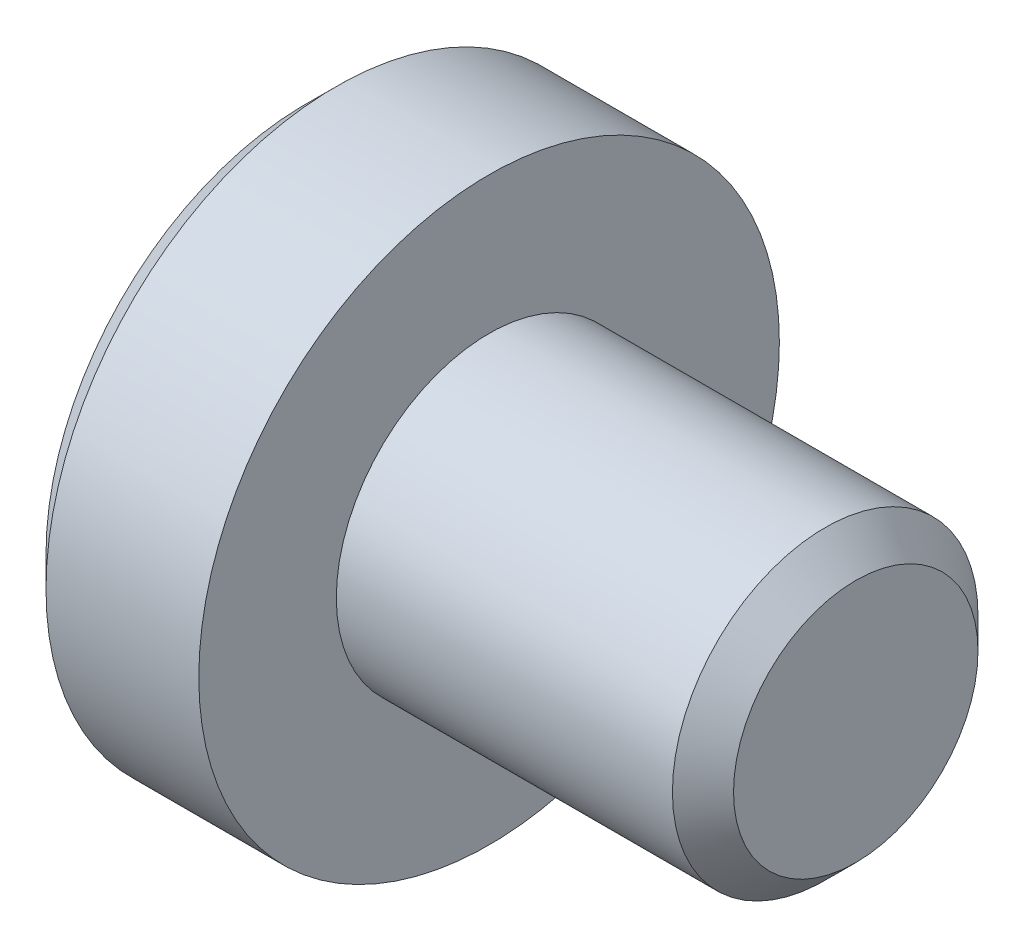
ISO-10303-21;
HEADER;
FILE_DESCRIPTION(('STEP AP214'),'2;1');
FILE_NAME('part.step','',(''),(''),'','','');
FILE_SCHEMA(('AUTOMOTIVE_DESIGN { 1 0 10303 214 1 1 1 1 }'));
ENDSEC;
DATA;
#1=APPLICATION_CONTEXT('core data for automotive mechanical design processes');
#2=APPLICATION_PROTOCOL_DEFINITION('international standard','automotive_design',2000,#1);
#3=PRODUCT_CONTEXT('',#1,'mechanical');
#4=PRODUCT('Part','Part','',(#3));
#5=PRODUCT_RELATED_PRODUCT_CATEGORY('part','',(#4));
#6=PRODUCT_DEFINITION_FORMATION('','',#4);
#7=PRODUCT_DEFINITION_CONTEXT('part definition',#1,'design');
#8=PRODUCT_DEFINITION('design','',#6,#7);
#9=PRODUCT_DEFINITION_SHAPE('','',#8);
#10=(LENGTH_UNIT() NAMED_UNIT(*) SI_UNIT(.MILLI.,.METRE.));
#11=(NAMED_UNIT(*) PLANE_ANGLE_UNIT() SI_UNIT($,.RADIAN.));
#12=(NAMED_UNIT(*) SI_UNIT($,.STERADIAN.) SOLID_ANGLE_UNIT());
#13=UNCERTAINTY_MEASURE_WITH_UNIT(LENGTH_MEASURE(1.E-05),#10,'distance_accuracy_value','');
#14=(GEOMETRIC_REPRESENTATION_CONTEXT(3) GLOBAL_UNCERTAINTY_ASSIGNED_CONTEXT((#13)) GLOBAL_UNIT_ASSIGNED_CONTEXT((#10,
#11,#12)) REPRESENTATION_CONTEXT('',''));
#15=CARTESIAN_POINT('',(0.,0.,0.));
#16=DIRECTION('',(0.,0.,1.));
#17=DIRECTION('',(1.,0.,0.));
#18=AXIS2_PLACEMENT_3D('',#15,#16,#17);
#19=CARTESIAN_POINT('',(0.,0.,0.));
#20=DIRECTION('',(-1.,0.,0.));
#21=DIRECTION('',(0.,0.,1.));
#22=AXIS2_PLACEMENT_3D('',#19,#20,#21);
#23=PLANE('',#22);
#24=CARTESIAN_POINT('',(0.,0.,0.));
#25=DIRECTION('',(-1.,0.,0.));
#26=DIRECTION('',(0.,0.,1.));
#27=AXIS2_PLACEMENT_3D('',#24,#25,#26);
#28=CIRCLE('',#27,4.25);
#29=CARTESIAN_POINT('',(0.,0.,4.25));
#30=VERTEX_POINT('',#29);
#31=EDGE_CURVE('E11',#30,#30,#28,.T.);
#32=ORIENTED_EDGE('',*,*,#31,.T.);
#33=EDGE_LOOP('',(#32));
#34=FACE_BOUND('',#33,.T.);
#35=DIRECTION('',(0.,0.5,-0.866025403784438));
#36=VECTOR('',#35,1.);
#37=CARTESIAN_POINT('',(0.,1.15470053837925,2.));
#38=LINE('',#37,#36);
#39=CARTESIAN_POINT('',(0.,1.15470053837925,2.));
#40=VERTEX_POINT('',#39);
#41=CARTESIAN_POINT('',(0.,2.3094010767585,0.));
#42=VERTEX_POINT('',#41);
#43=EDGE_CURVE('E67',#40,#42,#38,.T.);
#44=ORIENTED_EDGE('',*,*,#43,.F.);
#45=DIRECTION('',(0.,1.,0.));
#46=VECTOR('',#45,1.);
#47=CARTESIAN_POINT('',(0.,-1.15470053837925,2.));
#48=LINE('',#47,#46);
#49=CARTESIAN_POINT('',(0.,-1.15470053837925,2.));
#50=VERTEX_POINT('',#49);
#51=EDGE_CURVE('E150',#50,#40,#48,.T.);
#52=ORIENTED_EDGE('',*,*,#51,.F.);
#53=DIRECTION('',(0.,0.5,0.866025403784439));
#54=VECTOR('',#53,1.);
#55=CARTESIAN_POINT('',(0.,-2.3094010767585,0.));
#56=LINE('',#55,#54);
#57=CARTESIAN_POINT('',(0.,-2.3094010767585,0.));
#58=VERTEX_POINT('',#57);
#59=EDGE_CURVE('E148',#58,#50,#56,.T.);
#60=ORIENTED_EDGE('',*,*,#59,.F.);
#61=DIRECTION('',(0.,-0.5,0.866025403784439));
#62=VECTOR('',#61,1.);
#63=CARTESIAN_POINT('',(0.,-1.15470053837925,-2.));
#64=LINE('',#63,#62);
#65=CARTESIAN_POINT('',(0.,-1.15470053837925,-2.));
#66=VERTEX_POINT('',#65);
#67=EDGE_CURVE('E115',#66,#58,#64,.T.);
#68=ORIENTED_EDGE('',*,*,#67,.F.);
#69=DIRECTION('',(0.,-1.,0.));
#70=VECTOR('',#69,1.);
#71=CARTESIAN_POINT('',(0.,1.15470053837925,-2.));
#72=LINE('',#71,#70);
#73=CARTESIAN_POINT('',(0.,1.15470053837925,-2.));
#74=VERTEX_POINT('',#73);
#75=EDGE_CURVE('E144',#74,#66,#72,.T.);
#76=ORIENTED_EDGE('',*,*,#75,.F.);
#77=DIRECTION('',(0.,-0.5,-0.866025403784439));
#78=VECTOR('',#77,1.);
#79=CARTESIAN_POINT('',(0.,2.3094010767585,0.));
#80=LINE('',#79,#78);
#81=EDGE_CURVE('E141',#42,#74,#80,.T.);
#82=ORIENTED_EDGE('',*,*,#81,.F.);
#83=EDGE_LOOP('',(#44,#52,#60,#68,#76,#82));
#84=FACE_BOUND('',#83,.T.);
#85=ADVANCED_FACE('F51',(#34,#84),#23,.T.);
#86=CARTESIAN_POINT('',(9.,0.,0.));
#87=DIRECTION('',(1.,0.,0.));
#88=DIRECTION('',(0.,0.,-1.));
#89=AXIS2_PLACEMENT_3D('',#86,#87,#88);
#90=CYLINDRICAL_SURFACE('',#89,4.75);
#91=CARTESIAN_POINT('',(0.499999999999997,0.,0.));
#92=DIRECTION('',(-1.,0.,0.));
#93=DIRECTION('',(0.,0.,1.));
#94=AXIS2_PLACEMENT_3D('',#91,#92,#93);
#95=CIRCLE('',#94,4.75);
#96=CARTESIAN_POINT('',(0.499999999999997,0.,4.75));
#97=VERTEX_POINT('',#96);
#98=EDGE_CURVE('E60',#97,#97,#95,.F.);
#99=ORIENTED_EDGE('',*,*,#98,.T.);
#100=EDGE_LOOP('',(#99));
#101=FACE_BOUND('',#100,.T.);
#102=CARTESIAN_POINT('',(3.,0.,0.));
#103=DIRECTION('',(1.,0.,0.));
#104=DIRECTION('',(0.,0.,-1.));
#105=AXIS2_PLACEMENT_3D('',#102,#103,#104);
#106=CIRCLE('',#105,4.75);
#107=CARTESIAN_POINT('',(3.,0.,-4.75));
#108=VERTEX_POINT('',#107);
#109=EDGE_CURVE('E162',#108,#108,#106,.T.);
#110=ORIENTED_EDGE('',*,*,#109,.F.);
#111=EDGE_LOOP('',(#110));
#112=FACE_BOUND('',#111,.T.);
#113=ADVANCED_FACE('F173',(#101,#112),#90,.T.);
#114=CARTESIAN_POINT('',(3.,4.75,0.));
#115=DIRECTION('',(1.,0.,0.));
#116=DIRECTION('',(0.,0.,-1.));
#117=AXIS2_PLACEMENT_3D('',#114,#115,#116);
#118=PLANE('',#117);
#119=ORIENTED_EDGE('',*,*,#109,.T.);
#120=EDGE_LOOP('',(#119));
#121=FACE_BOUND('',#120,.T.);
#122=CARTESIAN_POINT('',(3.,0.,0.));
#123=DIRECTION('',(1.,0.,0.));
#124=DIRECTION('',(0.,0.,-1.));
#125=AXIS2_PLACEMENT_3D('',#122,#123,#124);
#126=CIRCLE('',#125,2.5);
#127=CARTESIAN_POINT('',(3.,0.,-2.5));
#128=VERTEX_POINT('',#127);
#129=EDGE_CURVE('E154',#128,#128,#126,.T.);
#130=ORIENTED_EDGE('',*,*,#129,.F.);
#131=EDGE_LOOP('',(#130));
#132=FACE_BOUND('',#131,.T.);
#133=ADVANCED_FACE('F192',(#121,#132),#118,.T.);
#134=CARTESIAN_POINT('',(9.,0.,0.));
#135=DIRECTION('',(1.,0.,0.));
#136=DIRECTION('',(0.,0.,-1.));
#137=AXIS2_PLACEMENT_3D('',#134,#135,#136);
#138=CYLINDRICAL_SURFACE('',#137,2.5);
#139=CARTESIAN_POINT('',(8.5,0.,0.));
#140=DIRECTION('',(1.,0.,0.));
#141=DIRECTION('',(0.,0.,-1.));
#142=AXIS2_PLACEMENT_3D('',#139,#140,#141);
#143=CIRCLE('',#142,2.5);
#144=CARTESIAN_POINT('',(8.5,0.,-2.5));
#145=VERTEX_POINT('',#144);
#146=EDGE_CURVE('E168',#145,#145,#143,.F.);
#147=ORIENTED_EDGE('',*,*,#146,.T.);
#148=EDGE_LOOP('',(#147));
#149=FACE_BOUND('',#148,.T.);
#150=ORIENTED_EDGE('',*,*,#129,.T.);
#151=EDGE_LOOP('',(#150));
#152=FACE_BOUND('',#151,.T.);
#153=ADVANCED_FACE('F203',(#149,#152),#138,.T.);
#154=CARTESIAN_POINT('',(9.,2.5,0.));
#155=DIRECTION('',(1.,0.,0.));
#156=DIRECTION('',(0.,0.,-1.));
#157=AXIS2_PLACEMENT_3D('',#154,#155,#156);
#158=PLANE('',#157);
#159=CARTESIAN_POINT('',(9.,0.,0.));
#160=DIRECTION('',(1.,0.,0.));
#161=DIRECTION('',(0.,0.,-1.));
#162=AXIS2_PLACEMENT_3D('',#159,#160,#161);
#163=CIRCLE('',#162,2.);
#164=CARTESIAN_POINT('',(9.,0.,-2.));
#165=VERTEX_POINT('',#164);
#166=EDGE_CURVE('E165',#165,#165,#163,.T.);
#167=ORIENTED_EDGE('',*,*,#166,.T.);
#168=EDGE_LOOP('',(#167));
#169=FACE_BOUND('',#168,.T.);
#170=ADVANCED_FACE('F207',(#169),#158,.T.);
#171=CARTESIAN_POINT('',(2.75,1.15470053837925,2.));
#172=DIRECTION('',(0.,0.866025403784439,0.5));
#173=DIRECTION('',(0.,-0.5,0.866025403784439));
#174=AXIS2_PLACEMENT_3D('',#171,#172,#173);
#175=PLANE('',#174);
#176=ORIENTED_EDGE('',*,*,#43,.T.);
#177=DIRECTION('',(-1.,0.,0.));
#178=VECTOR('',#177,1.);
#179=CARTESIAN_POINT('',(2.75,2.3094010767585,0.));
#180=LINE('',#179,#178);
#181=CARTESIAN_POINT('',(2.75,2.3094010767585,0.));
#182=VERTEX_POINT('',#181);
#183=EDGE_CURVE('E97',#182,#42,#180,.T.);
#184=ORIENTED_EDGE('',*,*,#183,.F.);
#185=DIRECTION('',(0.,0.5,-0.866025403784438));
#186=VECTOR('',#185,1.);
#187=CARTESIAN_POINT('',(2.75,1.15470053837925,2.));
#188=LINE('',#187,#186);
#189=CARTESIAN_POINT('',(2.75,1.15470053837925,2.));
#190=VERTEX_POINT('',#189);
#191=EDGE_CURVE('E152',#190,#182,#188,.T.);
#192=ORIENTED_EDGE('',*,*,#191,.F.);
#193=DIRECTION('',(-1.,0.,0.));
#194=VECTOR('',#193,1.);
#195=CARTESIAN_POINT('',(2.75,1.15470053837925,2.));
#196=LINE('',#195,#194);
#197=EDGE_CURVE('E75',#190,#40,#196,.T.);
#198=ORIENTED_EDGE('',*,*,#197,.T.);
#199=EDGE_LOOP('',(#176,#184,#192,#198));
#200=FACE_BOUND('',#199,.T.);
#201=ADVANCED_FACE('F211',(#200),#175,.F.);
#202=CARTESIAN_POINT('',(2.75,-1.15470053837925,2.));
#203=DIRECTION('',(0.,0.,1.));
#204=DIRECTION('',(0.,-1.,0.));
#205=AXIS2_PLACEMENT_3D('',#202,#203,#204);
#206=PLANE('',#205);
#207=ORIENTED_EDGE('',*,*,#51,.T.);
#208=ORIENTED_EDGE('',*,*,#197,.F.);
#209=DIRECTION('',(0.,1.,0.));
#210=VECTOR('',#209,1.);
#211=CARTESIAN_POINT('',(2.75,-1.15470053837925,2.));
#212=LINE('',#211,#210);
#213=CARTESIAN_POINT('',(2.75,-1.15470053837925,2.));
#214=VERTEX_POINT('',#213);
#215=EDGE_CURVE('E127',#214,#190,#212,.T.);
#216=ORIENTED_EDGE('',*,*,#215,.F.);
#217=DIRECTION('',(-1.,0.,0.));
#218=VECTOR('',#217,1.);
#219=CARTESIAN_POINT('',(2.75,-1.15470053837925,2.));
#220=LINE('',#219,#218);
#221=EDGE_CURVE('E119',#214,#50,#220,.T.);
#222=ORIENTED_EDGE('',*,*,#221,.T.);
#223=EDGE_LOOP('',(#207,#208,#216,#222));
#224=FACE_BOUND('',#223,.T.);
#225=ADVANCED_FACE('F215',(#224),#206,.F.);
#226=CARTESIAN_POINT('',(2.75,-2.3094010767585,0.));
#227=DIRECTION('',(0.,-0.866025403784439,0.5));
#228=DIRECTION('',(0.,-0.5,-0.866025403784439));
#229=AXIS2_PLACEMENT_3D('',#226,#227,#228);
#230=PLANE('',#229);
#231=ORIENTED_EDGE('',*,*,#59,.T.);
#232=ORIENTED_EDGE('',*,*,#221,.F.);
#233=DIRECTION('',(0.,0.5,0.866025403784439));
#234=VECTOR('',#233,1.);
#235=CARTESIAN_POINT('',(2.75,-2.3094010767585,0.));
#236=LINE('',#235,#234);
#237=CARTESIAN_POINT('',(2.75,-2.3094010767585,0.));
#238=VERTEX_POINT('',#237);
#239=EDGE_CURVE('E123',#238,#214,#236,.T.);
#240=ORIENTED_EDGE('',*,*,#239,.F.);
#241=DIRECTION('',(-1.,0.,0.));
#242=VECTOR('',#241,1.);
#243=CARTESIAN_POINT('',(2.75,-2.3094010767585,0.));
#244=LINE('',#243,#242);
#245=EDGE_CURVE('E108',#238,#58,#244,.T.);
#246=ORIENTED_EDGE('',*,*,#245,.T.);
#247=EDGE_LOOP('',(#231,#232,#240,#246));
#248=FACE_BOUND('',#247,.T.);
#249=ADVANCED_FACE('F124',(#248),#230,.F.);
#250=CARTESIAN_POINT('',(2.75,-1.15470053837925,-2.));
#251=DIRECTION('',(0.,-0.866025403784438,-0.5));
#252=DIRECTION('',(0.,0.5,-0.866025403784439));
#253=AXIS2_PLACEMENT_3D('',#250,#251,#252);
#254=PLANE('',#253);
#255=ORIENTED_EDGE('',*,*,#67,.T.);
#256=ORIENTED_EDGE('',*,*,#245,.F.);
#257=DIRECTION('',(0.,-0.5,0.866025403784439));
#258=VECTOR('',#257,1.);
#259=CARTESIAN_POINT('',(2.75,-1.15470053837925,-2.));
#260=LINE('',#259,#258);
#261=CARTESIAN_POINT('',(2.75,-1.15470053837925,-2.));
#262=VERTEX_POINT('',#261);
#263=EDGE_CURVE('E112',#262,#238,#260,.T.);
#264=ORIENTED_EDGE('',*,*,#263,.F.);
#265=DIRECTION('',(-1.,0.,0.));
#266=VECTOR('',#265,1.);
#267=CARTESIAN_POINT('',(2.75,-1.15470053837925,-2.));
#268=LINE('',#267,#266);
#269=EDGE_CURVE('E120',#262,#66,#268,.T.);
#270=ORIENTED_EDGE('',*,*,#269,.T.);
#271=EDGE_LOOP('',(#255,#256,#264,#270));
#272=FACE_BOUND('',#271,.T.);
#273=ADVANCED_FACE('F110',(#272),#254,.F.);
#274=CARTESIAN_POINT('',(2.75,1.15470053837925,-2.));
#275=DIRECTION('',(0.,0.,-1.));
#276=DIRECTION('',(-1.,0.,0.));
#277=AXIS2_PLACEMENT_3D('',#274,#275,#276);
#278=PLANE('',#277);
#279=ORIENTED_EDGE('',*,*,#75,.T.);
#280=ORIENTED_EDGE('',*,*,#269,.F.);
#281=DIRECTION('',(0.,-1.,0.));
#282=VECTOR('',#281,1.);
#283=CARTESIAN_POINT('',(2.75,1.15470053837925,-2.));
#284=LINE('',#283,#282);
#285=CARTESIAN_POINT('',(2.75,1.15470053837925,-2.));
#286=VERTEX_POINT('',#285);
#287=EDGE_CURVE('E133',#286,#262,#284,.T.);
#288=ORIENTED_EDGE('',*,*,#287,.F.);
#289=DIRECTION('',(-1.,0.,0.));
#290=VECTOR('',#289,1.);
#291=CARTESIAN_POINT('',(2.75,1.15470053837925,-2.));
#292=LINE('',#291,#290);
#293=EDGE_CURVE('E157',#286,#74,#292,.T.);
#294=ORIENTED_EDGE('',*,*,#293,.T.);
#295=EDGE_LOOP('',(#279,#280,#288,#294));
#296=FACE_BOUND('',#295,.T.);
#297=ADVANCED_FACE('F219',(#296),#278,.F.);
#298=CARTESIAN_POINT('',(2.75,2.3094010767585,0.));
#299=DIRECTION('',(0.,0.866025403784439,-0.5));
#300=DIRECTION('',(0.,0.5,0.866025403784439));
#301=AXIS2_PLACEMENT_3D('',#298,#299,#300);
#302=PLANE('',#301);
#303=ORIENTED_EDGE('',*,*,#81,.T.);
#304=ORIENTED_EDGE('',*,*,#293,.F.);
#305=DIRECTION('',(0.,-0.5,-0.866025403784439));
#306=VECTOR('',#305,1.);
#307=CARTESIAN_POINT('',(2.75,2.3094010767585,0.));
#308=LINE('',#307,#306);
#309=EDGE_CURVE('E135',#182,#286,#308,.T.);
#310=ORIENTED_EDGE('',*,*,#309,.F.);
#311=ORIENTED_EDGE('',*,*,#183,.T.);
#312=EDGE_LOOP('',(#303,#304,#310,#311));
#313=FACE_BOUND('',#312,.T.);
#314=ADVANCED_FACE('F216',(#313),#302,.F.);
#315=CARTESIAN_POINT('',(2.75,0.,0.));
#316=DIRECTION('',(-1.,0.,0.));
#317=DIRECTION('',(0.,0.,1.));
#318=AXIS2_PLACEMENT_3D('',#315,#316,#317);
#319=PLANE('',#318);
#320=ORIENTED_EDGE('',*,*,#191,.T.);
#321=ORIENTED_EDGE('',*,*,#309,.T.);
#322=ORIENTED_EDGE('',*,*,#287,.T.);
#323=ORIENTED_EDGE('',*,*,#263,.T.);
#324=ORIENTED_EDGE('',*,*,#239,.T.);
#325=ORIENTED_EDGE('',*,*,#215,.T.);
#326=EDGE_LOOP('',(#320,#321,#322,#323,#324,#325));
#327=FACE_BOUND('',#326,.T.);
#328=ADVANCED_FACE('F130',(#327),#319,.T.);
#329=CARTESIAN_POINT('',(9.,0.,0.));
#330=DIRECTION('',(-1.,0.,0.));
#331=DIRECTION('',(0.,0.,1.));
#332=AXIS2_PLACEMENT_3D('',#329,#330,#331);
#333=CONICAL_SURFACE('',#332,2.,0.785398163397446);
#334=ORIENTED_EDGE('',*,*,#146,.F.);
#335=EDGE_LOOP('',(#334));
#336=FACE_BOUND('',#335,.T.);
#337=ORIENTED_EDGE('',*,*,#166,.F.);
#338=EDGE_LOOP('',(#337));
#339=FACE_BOUND('',#338,.T.);
#340=ADVANCED_FACE('F177',(#336,#339),#333,.T.);
#341=CARTESIAN_POINT('',(0.499999999999997,0.,0.));
#342=DIRECTION('',(1.,0.,0.));
#343=DIRECTION('',(0.,0.,-1.));
#344=AXIS2_PLACEMENT_3D('',#341,#342,#343);
#345=CONICAL_SURFACE('',#344,4.75,0.78539816339745);
#346=ORIENTED_EDGE('',*,*,#31,.F.);
#347=EDGE_LOOP('',(#346));
#348=FACE_BOUND('',#347,.T.);
#349=ORIENTED_EDGE('',*,*,#98,.F.);
#350=EDGE_LOOP('',(#349));
#351=FACE_BOUND('',#350,.T.);
#352=ADVANCED_FACE('F54',(#348,#351),#345,.T.);
#353=CLOSED_SHELL('',(#85,#113,#133,#153,#170,#201,#225,#249,#273,#297,#314,#328,#340,#352));
#354=MANIFOLD_SOLID_BREP('B2',#353);
#355=ADVANCED_BREP_SHAPE_REPRESENTATION('',(#18,#354),#14);
#356=SHAPE_DEFINITION_REPRESENTATION(#9,#355);
ENDSEC;
END-ISO-10303-21;
